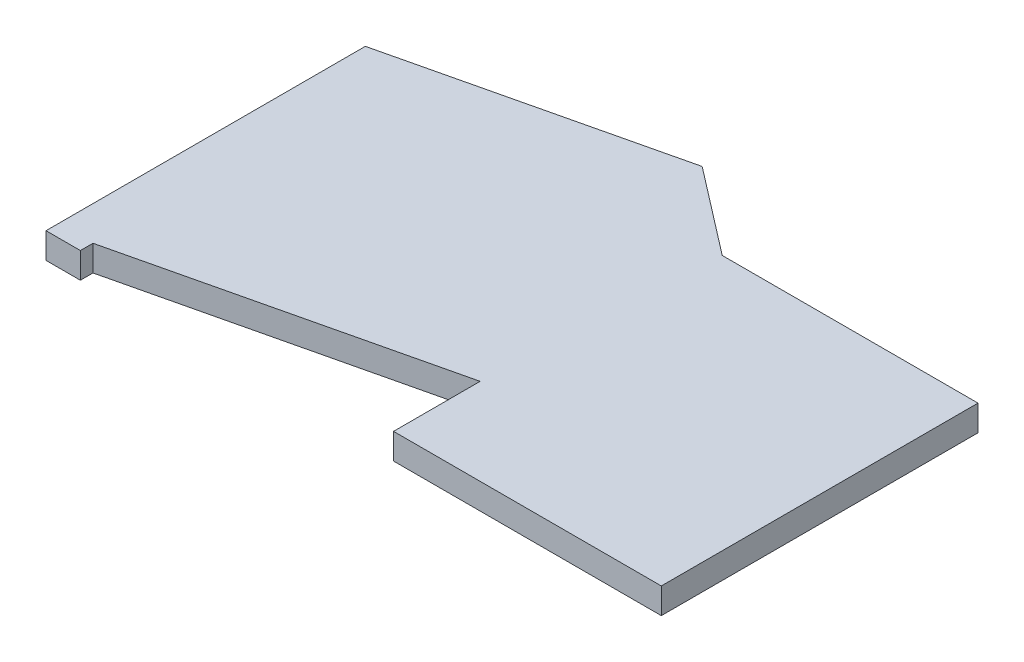
ISO-10303-21;
HEADER;
FILE_DESCRIPTION(('STEP AP214'),'2;1');
FILE_NAME('part.step','',(''),(''),'','','');
FILE_SCHEMA(('AUTOMOTIVE_DESIGN { 1 0 10303 214 1 1 1 1 }'));
ENDSEC;
DATA;
#1=APPLICATION_CONTEXT('core data for automotive mechanical design processes');
#2=APPLICATION_PROTOCOL_DEFINITION('international standard','automotive_design',2000,#1);
#3=PRODUCT_CONTEXT('',#1,'mechanical');
#4=PRODUCT('Part','Part','',(#3));
#5=PRODUCT_RELATED_PRODUCT_CATEGORY('part','',(#4));
#6=PRODUCT_DEFINITION_FORMATION('','',#4);
#7=PRODUCT_DEFINITION_CONTEXT('part definition',#1,'design');
#8=PRODUCT_DEFINITION('design','',#6,#7);
#9=PRODUCT_DEFINITION_SHAPE('','',#8);
#10=(LENGTH_UNIT() NAMED_UNIT(*) SI_UNIT(.MILLI.,.METRE.));
#11=(NAMED_UNIT(*) PLANE_ANGLE_UNIT() SI_UNIT($,.RADIAN.));
#12=(NAMED_UNIT(*) SI_UNIT($,.STERADIAN.) SOLID_ANGLE_UNIT());
#13=UNCERTAINTY_MEASURE_WITH_UNIT(LENGTH_MEASURE(1.E-05),#10,'distance_accuracy_value','');
#14=(GEOMETRIC_REPRESENTATION_CONTEXT(3) GLOBAL_UNCERTAINTY_ASSIGNED_CONTEXT((#13)) GLOBAL_UNIT_ASSIGNED_CONTEXT((#10,
#11,#12)) REPRESENTATION_CONTEXT('',''));
#15=CARTESIAN_POINT('',(0.,0.,0.));
#16=DIRECTION('',(0.,0.,1.));
#17=DIRECTION('',(1.,0.,0.));
#18=AXIS2_PLACEMENT_3D('',#15,#16,#17);
#19=CARTESIAN_POINT('',(38.8650366494886,72.7822311911764,146.132559408008));
#20=DIRECTION('',(-0.60991717821031,0.,0.792465163728963));
#21=DIRECTION('',(0.792465163728963,0.,0.60991717821031));
#22=AXIS2_PLACEMENT_3D('',#19,#20,#21);
#23=PLANE('',#22);
#24=DIRECTION('',(-0.792465163728963,0.,-0.60991717821031));
#25=VECTOR('',#24,1.);
#26=CARTESIAN_POINT('',(38.8650366494886,70.2422311911764,146.132559408008));
#27=LINE('',#26,#25);
#28=CARTESIAN_POINT('',(38.9335277332057,70.2422311911764,146.18527325642));
#29=VERTEX_POINT('',#28);
#30=CARTESIAN_POINT('',(30.3425754256057,70.2422311911764,139.573286219748));
#31=VERTEX_POINT('',#30);
#32=EDGE_CURVE('E88',#29,#31,#27,.T.);
#33=ORIENTED_EDGE('',*,*,#32,.T.);
#34=DIRECTION('',(0.,-1.,0.));
#35=VECTOR('',#34,1.);
#36=CARTESIAN_POINT('',(30.3425754256057,72.7822311911764,139.573286219748));
#37=LINE('',#36,#35);
#38=CARTESIAN_POINT('',(30.3425754256057,72.7822311911764,139.573286219748));
#39=VERTEX_POINT('',#38);
#40=EDGE_CURVE('E11',#39,#31,#37,.T.);
#41=ORIENTED_EDGE('',*,*,#40,.F.);
#42=DIRECTION('',(-0.792465163728913,0.,-0.609917178210375));
#43=VECTOR('',#42,1.);
#44=CARTESIAN_POINT('',(38.9335277332057,72.7822311911764,146.18527325642));
#45=LINE('',#44,#43);
#46=CARTESIAN_POINT('',(38.9335277332057,72.7822311911764,146.18527325642));
#47=VERTEX_POINT('',#46);
#48=EDGE_CURVE('E93',#47,#39,#45,.T.);
#49=ORIENTED_EDGE('',*,*,#48,.F.);
#50=DIRECTION('',(0.,-1.,0.));
#51=VECTOR('',#50,1.);
#52=CARTESIAN_POINT('',(38.9335277332057,72.7822311911764,146.18527325642));
#53=LINE('',#52,#51);
#54=EDGE_CURVE('E137',#47,#29,#53,.T.);
#55=ORIENTED_EDGE('',*,*,#54,.T.);
#56=EDGE_LOOP('',(#33,#41,#49,#55));
#57=FACE_BOUND('',#56,.T.);
#58=ADVANCED_FACE('F33',(#57),#23,.F.);
#59=CARTESIAN_POINT('',(5.74112356910634,72.7822311911764,145.387505768199));
#60=DIRECTION('',(0.23000038695568,0.,0.973190537356502));
#61=DIRECTION('',(0.973190537356502,0.,-0.23000038695568));
#62=AXIS2_PLACEMENT_3D('',#59,#60,#61);
#63=PLANE('',#62);
#64=DIRECTION('',(-0.973190537356502,0.,0.23000038695568));
#65=VECTOR('',#64,1.);
#66=CARTESIAN_POINT('',(5.74112356910634,70.2422311911764,145.387505768199));
#67=LINE('',#66,#65);
#68=CARTESIAN_POINT('',(3.46479950593408,70.2422311911764,145.925484093377));
#69=VERTEX_POINT('',#68);
#70=EDGE_CURVE('E142',#31,#69,#67,.T.);
#71=ORIENTED_EDGE('',*,*,#70,.T.);
#72=DIRECTION('',(0.,-1.,0.));
#73=VECTOR('',#72,1.);
#74=CARTESIAN_POINT('',(3.46479950593408,72.7822311911764,145.925484093377));
#75=LINE('',#74,#73);
#76=CARTESIAN_POINT('',(3.46479950593408,72.7822311911764,145.925484093377));
#77=VERTEX_POINT('',#76);
#78=EDGE_CURVE('E41',#77,#69,#75,.T.);
#79=ORIENTED_EDGE('',*,*,#78,.F.);
#80=DIRECTION('',(-0.9731905373565,0.,0.230000386955687));
#81=VECTOR('',#80,1.);
#82=CARTESIAN_POINT('',(30.3425754256057,72.7822311911764,139.573286219748));
#83=LINE('',#82,#81);
#84=EDGE_CURVE('E204',#39,#77,#83,.T.);
#85=ORIENTED_EDGE('',*,*,#84,.F.);
#86=ORIENTED_EDGE('',*,*,#40,.T.);
#87=EDGE_LOOP('',(#71,#79,#85,#86));
#88=FACE_BOUND('',#87,.T.);
#89=ADVANCED_FACE('F206',(#88),#63,.F.);
#90=CARTESIAN_POINT('',(3.46479950593408,72.7822311911764,145.925484093377));
#91=DIRECTION('',(1.,0.,0.));
#92=DIRECTION('',(0.,0.,-1.));
#93=AXIS2_PLACEMENT_3D('',#90,#91,#92);
#94=PLANE('',#93);
#95=DIRECTION('',(0.,0.,1.));
#96=VECTOR('',#95,1.);
#97=CARTESIAN_POINT('',(3.46479950593408,70.2422311911764,145.925484093377));
#98=LINE('',#97,#96);
#99=CARTESIAN_POINT('',(3.46479950593408,70.2422311911764,177.42727325642));
#100=VERTEX_POINT('',#99);
#101=EDGE_CURVE('E144',#69,#100,#98,.T.);
#102=ORIENTED_EDGE('',*,*,#101,.T.);
#103=DIRECTION('',(0.,-1.,0.));
#104=VECTOR('',#103,1.);
#105=CARTESIAN_POINT('',(3.46479950593408,72.7822311911764,177.42727325642));
#106=LINE('',#105,#104);
#107=CARTESIAN_POINT('',(3.46479950593408,72.7822311911764,177.42727325642));
#108=VERTEX_POINT('',#107);
#109=EDGE_CURVE('E171',#108,#100,#106,.T.);
#110=ORIENTED_EDGE('',*,*,#109,.F.);
#111=DIRECTION('',(0.,0.,1.));
#112=VECTOR('',#111,1.);
#113=CARTESIAN_POINT('',(3.46479950593408,72.7822311911764,145.925484093377));
#114=LINE('',#113,#112);
#115=EDGE_CURVE('E180',#77,#108,#114,.T.);
#116=ORIENTED_EDGE('',*,*,#115,.F.);
#117=ORIENTED_EDGE('',*,*,#78,.T.);
#118=EDGE_LOOP('',(#102,#110,#116,#117));
#119=FACE_BOUND('',#118,.T.);
#120=ADVANCED_FACE('F178',(#119),#94,.F.);
#121=CARTESIAN_POINT('',(3.46479950593408,72.7822311911764,177.42727325642));
#122=DIRECTION('',(0.,0.,-1.));
#123=DIRECTION('',(-1.,0.,0.));
#124=AXIS2_PLACEMENT_3D('',#121,#122,#123);
#125=PLANE('',#124);
#126=DIRECTION('',(1.,0.,0.));
#127=VECTOR('',#126,1.);
#128=CARTESIAN_POINT('',(3.46479950593408,70.2422311911764,177.42727325642));
#129=LINE('',#128,#127);
#130=CARTESIAN_POINT('',(6.8560241986277,70.2422311911764,177.42727325642));
#131=VERTEX_POINT('',#130);
#132=EDGE_CURVE('E146',#100,#131,#129,.T.);
#133=ORIENTED_EDGE('',*,*,#132,.T.);
#134=DIRECTION('',(0.,-1.,0.));
#135=VECTOR('',#134,1.);
#136=CARTESIAN_POINT('',(6.8560241986277,72.7822311911764,177.42727325642));
#137=LINE('',#136,#135);
#138=CARTESIAN_POINT('',(6.8560241986277,72.7822311911764,177.42727325642));
#139=VERTEX_POINT('',#138);
#140=EDGE_CURVE('E168',#139,#131,#137,.T.);
#141=ORIENTED_EDGE('',*,*,#140,.F.);
#142=DIRECTION('',(1.,0.,0.));
#143=VECTOR('',#142,1.);
#144=CARTESIAN_POINT('',(3.46479950593408,72.7822311911764,177.42727325642));
#145=LINE('',#144,#143);
#146=EDGE_CURVE('E198',#108,#139,#145,.T.);
#147=ORIENTED_EDGE('',*,*,#146,.F.);
#148=ORIENTED_EDGE('',*,*,#109,.T.);
#149=EDGE_LOOP('',(#133,#141,#147,#148));
#150=FACE_BOUND('',#149,.T.);
#151=ADVANCED_FACE('F189',(#150),#125,.F.);
#152=CARTESIAN_POINT('',(6.8560241986277,72.7822311911764,177.42727325642));
#153=DIRECTION('',(-1.,0.,0.));
#154=DIRECTION('',(0.,0.,1.));
#155=AXIS2_PLACEMENT_3D('',#152,#153,#154);
#156=PLANE('',#155);
#157=DIRECTION('',(0.,0.,-1.));
#158=VECTOR('',#157,1.);
#159=CARTESIAN_POINT('',(6.8560241986277,70.2422311911764,177.42727325642));
#160=LINE('',#159,#158);
#161=CARTESIAN_POINT('',(6.8560241986277,70.2422311911764,176.182680272464));
#162=VERTEX_POINT('',#161);
#163=EDGE_CURVE('E148',#131,#162,#160,.T.);
#164=ORIENTED_EDGE('',*,*,#163,.T.);
#165=DIRECTION('',(0.,-1.,0.));
#166=VECTOR('',#165,1.);
#167=CARTESIAN_POINT('',(6.8560241986277,72.7822311911764,176.182680272464));
#168=LINE('',#167,#166);
#169=CARTESIAN_POINT('',(6.8560241986277,72.7822311911764,176.182680272464));
#170=VERTEX_POINT('',#169);
#171=EDGE_CURVE('E165',#170,#162,#168,.T.);
#172=ORIENTED_EDGE('',*,*,#171,.F.);
#173=DIRECTION('',(0.,0.,-1.));
#174=VECTOR('',#173,1.);
#175=CARTESIAN_POINT('',(6.8560241986277,72.7822311911764,177.42727325642));
#176=LINE('',#175,#174);
#177=EDGE_CURVE('E195',#139,#170,#176,.T.);
#178=ORIENTED_EDGE('',*,*,#177,.F.);
#179=ORIENTED_EDGE('',*,*,#140,.T.);
#180=EDGE_LOOP('',(#164,#172,#178,#179));
#181=FACE_BOUND('',#180,.T.);
#182=ADVANCED_FACE('F193',(#181),#156,.F.);
#183=CARTESIAN_POINT('',(6.8560241986277,72.7822311911764,176.182680272464));
#184=DIRECTION('',(-0.230000386955677,0.,-0.973190537356503));
#185=DIRECTION('',(-0.973190537356503,0.,0.230000386955677));
#186=AXIS2_PLACEMENT_3D('',#183,#184,#185);
#187=PLANE('',#186);
#188=DIRECTION('',(0.973190537356503,0.,-0.230000386955677));
#189=VECTOR('',#188,1.);
#190=CARTESIAN_POINT('',(6.8560241986277,70.2422311911764,176.182680272464));
#191=LINE('',#190,#189);
#192=CARTESIAN_POINT('',(37.749955612754,70.2422311911764,168.881318507139));
#193=VERTEX_POINT('',#192);
#194=EDGE_CURVE('E150',#162,#193,#191,.T.);
#195=ORIENTED_EDGE('',*,*,#194,.T.);
#196=DIRECTION('',(0.,-1.,0.));
#197=VECTOR('',#196,1.);
#198=CARTESIAN_POINT('',(37.749955612754,72.7822311911764,168.881318507139));
#199=LINE('',#198,#197);
#200=CARTESIAN_POINT('',(37.749955612754,72.7822311911764,168.881318507139));
#201=VERTEX_POINT('',#200);
#202=EDGE_CURVE('E162',#201,#193,#199,.T.);
#203=ORIENTED_EDGE('',*,*,#202,.F.);
#204=DIRECTION('',(0.973190537356503,0.,-0.230000386955677));
#205=VECTOR('',#204,1.);
#206=CARTESIAN_POINT('',(6.8560241986277,72.7822311911764,176.182680272464));
#207=LINE('',#206,#205);
#208=EDGE_CURVE('E197',#170,#201,#207,.T.);
#209=ORIENTED_EDGE('',*,*,#208,.F.);
#210=ORIENTED_EDGE('',*,*,#171,.T.);
#211=EDGE_LOOP('',(#195,#203,#209,#210));
#212=FACE_BOUND('',#211,.T.);
#213=ADVANCED_FACE('F232',(#212),#187,.F.);
#214=CARTESIAN_POINT('',(37.749955612754,72.7822311911764,168.881318507139));
#215=DIRECTION('',(1.,0.,0.));
#216=DIRECTION('',(0.,0.,-1.));
#217=AXIS2_PLACEMENT_3D('',#214,#215,#216);
#218=PLANE('',#217);
#219=DIRECTION('',(0.,0.,1.));
#220=VECTOR('',#219,1.);
#221=CARTESIAN_POINT('',(37.749955612754,70.2422311911764,168.881318507139));
#222=LINE('',#221,#220);
#223=CARTESIAN_POINT('',(37.749955612754,70.2422311911764,177.42727325642));
#224=VERTEX_POINT('',#223);
#225=EDGE_CURVE('E152',#193,#224,#222,.T.);
#226=ORIENTED_EDGE('',*,*,#225,.T.);
#227=DIRECTION('',(0.,-1.,0.));
#228=VECTOR('',#227,1.);
#229=CARTESIAN_POINT('',(37.749955612754,72.7822311911764,177.42727325642));
#230=LINE('',#229,#228);
#231=CARTESIAN_POINT('',(37.749955612754,72.7822311911764,177.42727325642));
#232=VERTEX_POINT('',#231);
#233=EDGE_CURVE('E131',#232,#224,#230,.T.);
#234=ORIENTED_EDGE('',*,*,#233,.F.);
#235=DIRECTION('',(0.,0.,1.));
#236=VECTOR('',#235,1.);
#237=CARTESIAN_POINT('',(37.749955612754,72.7822311911764,168.881318507139));
#238=LINE('',#237,#236);
#239=EDGE_CURVE('E120',#201,#232,#238,.T.);
#240=ORIENTED_EDGE('',*,*,#239,.F.);
#241=ORIENTED_EDGE('',*,*,#202,.T.);
#242=EDGE_LOOP('',(#226,#234,#240,#241));
#243=FACE_BOUND('',#242,.T.);
#244=ADVANCED_FACE('F235',(#243),#218,.F.);
#245=CARTESIAN_POINT('',(37.749955612754,72.7822311911764,177.42727325642));
#246=DIRECTION('',(0.,0.,-1.));
#247=DIRECTION('',(-1.,0.,0.));
#248=AXIS2_PLACEMENT_3D('',#245,#246,#247);
#249=PLANE('',#248);
#250=DIRECTION('',(1.,0.,0.));
#251=VECTOR('',#250,1.);
#252=CARTESIAN_POINT('',(37.749955612754,70.2422311911764,177.42727325642));
#253=LINE('',#252,#251);
#254=CARTESIAN_POINT('',(64.165955612754,70.2422311911764,177.42727325642));
#255=VERTEX_POINT('',#254);
#256=EDGE_CURVE('E129',#224,#255,#253,.T.);
#257=ORIENTED_EDGE('',*,*,#256,.T.);
#258=DIRECTION('',(0.,-1.,0.));
#259=VECTOR('',#258,1.);
#260=CARTESIAN_POINT('',(64.165955612754,72.7822311911764,177.42727325642));
#261=LINE('',#260,#259);
#262=CARTESIAN_POINT('',(64.165955612754,72.7822311911764,177.42727325642));
#263=VERTEX_POINT('',#262);
#264=EDGE_CURVE('E126',#263,#255,#261,.T.);
#265=ORIENTED_EDGE('',*,*,#264,.F.);
#266=DIRECTION('',(1.,0.,0.));
#267=VECTOR('',#266,1.);
#268=CARTESIAN_POINT('',(37.749955612754,72.7822311911764,177.42727325642));
#269=LINE('',#268,#267);
#270=EDGE_CURVE('E113',#232,#263,#269,.T.);
#271=ORIENTED_EDGE('',*,*,#270,.F.);
#272=ORIENTED_EDGE('',*,*,#233,.T.);
#273=EDGE_LOOP('',(#257,#265,#271,#272));
#274=FACE_BOUND('',#273,.T.);
#275=ADVANCED_FACE('F127',(#274),#249,.F.);
#276=CARTESIAN_POINT('',(64.165955612754,72.7822311911764,177.42727325642));
#277=DIRECTION('',(-1.,0.,0.));
#278=DIRECTION('',(0.,0.,1.));
#279=AXIS2_PLACEMENT_3D('',#276,#277,#278);
#280=PLANE('',#279);
#281=DIRECTION('',(0.,0.,-1.));
#282=VECTOR('',#281,1.);
#283=CARTESIAN_POINT('',(64.165955612754,70.2422311911764,177.42727325642));
#284=LINE('',#283,#282);
#285=CARTESIAN_POINT('',(64.165955612754,70.2422311911764,146.18527325642));
#286=VERTEX_POINT('',#285);
#287=EDGE_CURVE('E155',#255,#286,#284,.T.);
#288=ORIENTED_EDGE('',*,*,#287,.T.);
#289=DIRECTION('',(0.,-1.,0.));
#290=VECTOR('',#289,1.);
#291=CARTESIAN_POINT('',(64.165955612754,72.7822311911764,146.18527325642));
#292=LINE('',#291,#290);
#293=CARTESIAN_POINT('',(64.165955612754,72.7822311911764,146.18527325642));
#294=VERTEX_POINT('',#293);
#295=EDGE_CURVE('E132',#294,#286,#292,.T.);
#296=ORIENTED_EDGE('',*,*,#295,.F.);
#297=DIRECTION('',(0.,0.,-1.));
#298=VECTOR('',#297,1.);
#299=CARTESIAN_POINT('',(64.165955612754,72.7822311911764,177.42727325642));
#300=LINE('',#299,#298);
#301=EDGE_CURVE('E117',#263,#294,#300,.T.);
#302=ORIENTED_EDGE('',*,*,#301,.F.);
#303=ORIENTED_EDGE('',*,*,#264,.T.);
#304=EDGE_LOOP('',(#288,#296,#302,#303));
#305=FACE_BOUND('',#304,.T.);
#306=ADVANCED_FACE('F134',(#305),#280,.F.);
#307=CARTESIAN_POINT('',(61.879955612754,72.7822311911764,146.18527325642));
#308=DIRECTION('',(0.,0.,1.));
#309=DIRECTION('',(1.,0.,0.));
#310=AXIS2_PLACEMENT_3D('',#307,#308,#309);
#311=PLANE('',#310);
#312=DIRECTION('',(-1.,0.,0.));
#313=VECTOR('',#312,1.);
#314=CARTESIAN_POINT('',(61.879955612754,70.2422311911764,146.18527325642));
#315=LINE('',#314,#313);
#316=EDGE_CURVE('E84',#286,#29,#315,.T.);
#317=ORIENTED_EDGE('',*,*,#316,.T.);
#318=ORIENTED_EDGE('',*,*,#54,.F.);
#319=DIRECTION('',(-1.,0.,0.));
#320=VECTOR('',#319,1.);
#321=CARTESIAN_POINT('',(64.165955612754,72.7822311911764,146.18527325642));
#322=LINE('',#321,#320);
#323=EDGE_CURVE('E49',#294,#47,#322,.T.);
#324=ORIENTED_EDGE('',*,*,#323,.F.);
#325=ORIENTED_EDGE('',*,*,#295,.T.);
#326=EDGE_LOOP('',(#317,#318,#324,#325));
#327=FACE_BOUND('',#326,.T.);
#328=ADVANCED_FACE('F209',(#327),#311,.F.);
#329=CARTESIAN_POINT('',(0.,72.7822311911764,0.));
#330=DIRECTION('',(0.,1.,0.));
#331=DIRECTION('',(0.,0.,1.));
#332=AXIS2_PLACEMENT_3D('',#329,#330,#331);
#333=PLANE('',#332);
#334=ORIENTED_EDGE('',*,*,#48,.T.);
#335=ORIENTED_EDGE('',*,*,#84,.T.);
#336=ORIENTED_EDGE('',*,*,#115,.T.);
#337=ORIENTED_EDGE('',*,*,#146,.T.);
#338=ORIENTED_EDGE('',*,*,#177,.T.);
#339=ORIENTED_EDGE('',*,*,#208,.T.);
#340=ORIENTED_EDGE('',*,*,#239,.T.);
#341=ORIENTED_EDGE('',*,*,#270,.T.);
#342=ORIENTED_EDGE('',*,*,#301,.T.);
#343=ORIENTED_EDGE('',*,*,#323,.T.);
#344=EDGE_LOOP('',(#334,#335,#336,#337,#338,#339,#340,#341,#342,#343));
#345=FACE_BOUND('',#344,.T.);
#346=ADVANCED_FACE('F115',(#345),#333,.T.);
#347=CARTESIAN_POINT('',(0.,70.2422311911764,0.));
#348=DIRECTION('',(0.,1.,0.));
#349=DIRECTION('',(0.,0.,1.));
#350=AXIS2_PLACEMENT_3D('',#347,#348,#349);
#351=PLANE('',#350);
#352=ORIENTED_EDGE('',*,*,#32,.F.);
#353=ORIENTED_EDGE('',*,*,#316,.F.);
#354=ORIENTED_EDGE('',*,*,#287,.F.);
#355=ORIENTED_EDGE('',*,*,#256,.F.);
#356=ORIENTED_EDGE('',*,*,#225,.F.);
#357=ORIENTED_EDGE('',*,*,#194,.F.);
#358=ORIENTED_EDGE('',*,*,#163,.F.);
#359=ORIENTED_EDGE('',*,*,#132,.F.);
#360=ORIENTED_EDGE('',*,*,#101,.F.);
#361=ORIENTED_EDGE('',*,*,#70,.F.);
#362=EDGE_LOOP('',(#352,#353,#354,#355,#356,#357,#358,#359,#360,#361));
#363=FACE_BOUND('',#362,.T.);
#364=ADVANCED_FACE('F184',(#363),#351,.F.);
#365=CLOSED_SHELL('',(#58,#89,#120,#151,#182,#213,#244,#275,#306,#328,#346,#364));
#366=MANIFOLD_SOLID_BREP('B2',#365);
#367=ADVANCED_BREP_SHAPE_REPRESENTATION('',(#18,#366),#14);
#368=SHAPE_DEFINITION_REPRESENTATION(#9,#367);
ENDSEC;
END-ISO-10303-21;
